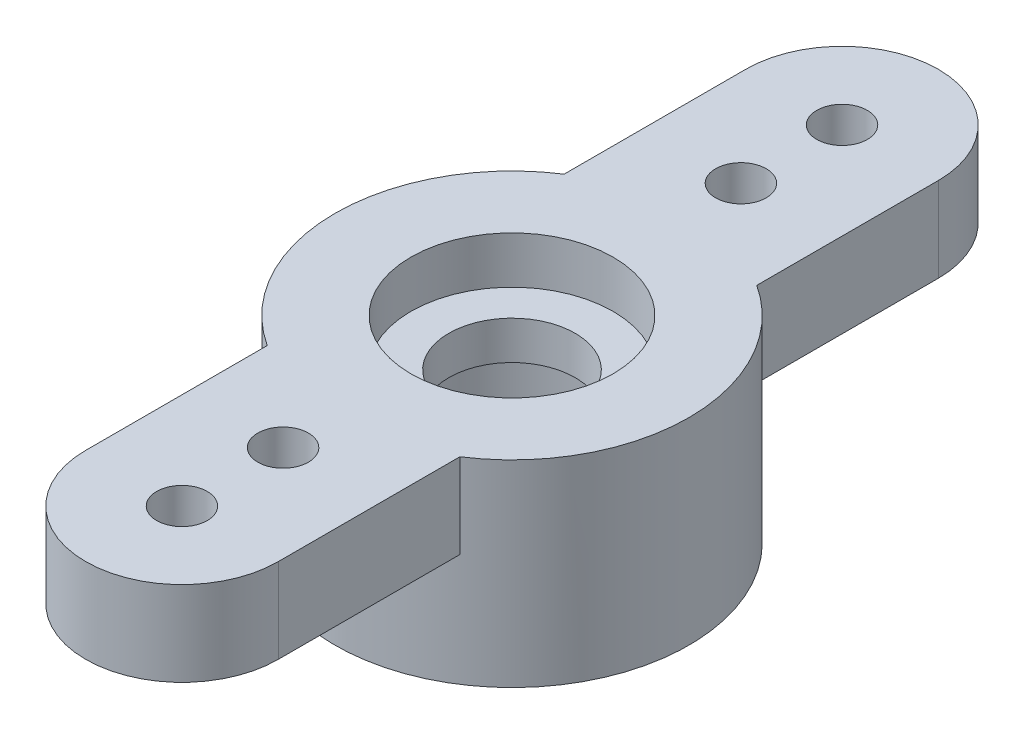
ISO-10303-21;
HEADER;
FILE_DESCRIPTION(('STEP AP214'),'2;1');
FILE_NAME('part.step','',(''),(''),'','','');
FILE_SCHEMA(('AUTOMOTIVE_DESIGN { 1 0 10303 214 1 1 1 1 }'));
ENDSEC;
DATA;
#1=APPLICATION_CONTEXT('core data for automotive mechanical design processes');
#2=APPLICATION_PROTOCOL_DEFINITION('international standard','automotive_design',2000,#1);
#3=PRODUCT_CONTEXT('',#1,'mechanical');
#4=PRODUCT('Part','Part','',(#3));
#5=PRODUCT_RELATED_PRODUCT_CATEGORY('part','',(#4));
#6=PRODUCT_DEFINITION_FORMATION('','',#4);
#7=PRODUCT_DEFINITION_CONTEXT('part definition',#1,'design');
#8=PRODUCT_DEFINITION('design','',#6,#7);
#9=PRODUCT_DEFINITION_SHAPE('','',#8);
#10=(LENGTH_UNIT() NAMED_UNIT(*) SI_UNIT(.MILLI.,.METRE.));
#11=(NAMED_UNIT(*) PLANE_ANGLE_UNIT() SI_UNIT($,.RADIAN.));
#12=(NAMED_UNIT(*) SI_UNIT($,.STERADIAN.) SOLID_ANGLE_UNIT());
#13=UNCERTAINTY_MEASURE_WITH_UNIT(LENGTH_MEASURE(1.E-05),#10,'distance_accuracy_value','');
#14=(GEOMETRIC_REPRESENTATION_CONTEXT(3) GLOBAL_UNCERTAINTY_ASSIGNED_CONTEXT((#13)) GLOBAL_UNIT_ASSIGNED_CONTEXT((#10,
#11,#12)) REPRESENTATION_CONTEXT('',''));
#15=CARTESIAN_POINT('',(0.,0.,0.));
#16=DIRECTION('',(0.,0.,1.));
#17=DIRECTION('',(1.,0.,0.));
#18=AXIS2_PLACEMENT_3D('',#15,#16,#17);
#19=CARTESIAN_POINT('',(0.,0.,0.));
#20=DIRECTION('',(0.,1.,0.));
#21=DIRECTION('',(-1.,0.,0.));
#22=AXIS2_PLACEMENT_3D('',#19,#20,#21);
#23=CYLINDRICAL_SURFACE('',#22,2.25);
#24=CARTESIAN_POINT('',(0.,-2.21,0.));
#25=DIRECTION('',(0.,1.,0.));
#26=DIRECTION('',(-1.,0.,0.));
#27=AXIS2_PLACEMENT_3D('',#24,#25,#26);
#28=CIRCLE('',#27,2.25);
#29=CARTESIAN_POINT('',(-2.25,-2.21,0.));
#30=VERTEX_POINT('',#29);
#31=EDGE_CURVE('E11',#30,#30,#28,.T.);
#32=ORIENTED_EDGE('',*,*,#31,.F.);
#33=EDGE_LOOP('',(#32));
#34=FACE_BOUND('',#33,.T.);
#35=CARTESIAN_POINT('',(0.,0.,0.));
#36=DIRECTION('',(0.,1.,0.));
#37=DIRECTION('',(-1.,0.,0.));
#38=AXIS2_PLACEMENT_3D('',#35,#36,#37);
#39=CIRCLE('',#38,2.25);
#40=CARTESIAN_POINT('',(-2.25,0.,0.));
#41=VERTEX_POINT('',#40);
#42=EDGE_CURVE('E194',#41,#41,#39,.T.);
#43=ORIENTED_EDGE('',*,*,#42,.T.);
#44=EDGE_LOOP('',(#43));
#45=FACE_BOUND('',#44,.T.);
#46=ADVANCED_FACE('F38',(#34,#45),#23,.F.);
#47=CARTESIAN_POINT('',(3.5,-2.21,0.));
#48=DIRECTION('',(0.,1.,0.));
#49=DIRECTION('',(-1.,0.,0.));
#50=AXIS2_PLACEMENT_3D('',#47,#48,#49);
#51=PLANE('',#50);
#52=CARTESIAN_POINT('',(0.,-2.21,0.));
#53=DIRECTION('',(0.,1.,0.));
#54=DIRECTION('',(-1.,0.,0.));
#55=AXIS2_PLACEMENT_3D('',#52,#53,#54);
#56=CIRCLE('',#55,3.5);
#57=CARTESIAN_POINT('',(-3.5,-2.21,0.));
#58=VERTEX_POINT('',#57);
#59=EDGE_CURVE('E46',#58,#58,#56,.T.);
#60=ORIENTED_EDGE('',*,*,#59,.F.);
#61=EDGE_LOOP('',(#60));
#62=FACE_BOUND('',#61,.T.);
#63=ORIENTED_EDGE('',*,*,#31,.T.);
#64=EDGE_LOOP('',(#63));
#65=FACE_BOUND('',#64,.T.);
#66=ADVANCED_FACE('F226',(#62,#65),#51,.F.);
#67=CARTESIAN_POINT('',(0.,0.,0.));
#68=DIRECTION('',(0.,1.,0.));
#69=DIRECTION('',(-1.,0.,0.));
#70=AXIS2_PLACEMENT_3D('',#67,#68,#69);
#71=CYLINDRICAL_SURFACE('',#70,3.5);
#72=CARTESIAN_POINT('',(0.,0.0149999999999994,0.));
#73=DIRECTION('',(0.,-1.,0.));
#74=DIRECTION('',(-1.,0.,0.));
#75=AXIS2_PLACEMENT_3D('',#72,#73,#74);
#76=CIRCLE('',#75,3.5);
#77=CARTESIAN_POINT('',(1.905,0.0149999999999996,2.93614968964459));
#78=VERTEX_POINT('',#77);
#79=CARTESIAN_POINT('',(-1.905,0.0149999999999992,2.93614968964459));
#80=VERTEX_POINT('',#79);
#81=EDGE_CURVE('E126',#78,#80,#76,.T.);
#82=ORIENTED_EDGE('',*,*,#81,.T.);
#83=DIRECTION('',(0.,1.,0.));
#84=VECTOR('',#83,1.);
#85=CARTESIAN_POINT('',(-1.905,0.0149999999999992,2.93614968964459));
#86=LINE('',#85,#84);
#87=CARTESIAN_POINT('',(-1.905,1.69,2.93614968964459));
#88=VERTEX_POINT('',#87);
#89=EDGE_CURVE('E146',#80,#88,#86,.T.);
#90=ORIENTED_EDGE('',*,*,#89,.T.);
#91=CARTESIAN_POINT('',(0.,1.69,0.));
#92=DIRECTION('',(0.,1.,0.));
#93=DIRECTION('',(-1.,0.,0.));
#94=AXIS2_PLACEMENT_3D('',#91,#92,#93);
#95=CIRCLE('',#94,3.5);
#96=CARTESIAN_POINT('',(-1.905,1.69,-2.93614968964459));
#97=VERTEX_POINT('',#96);
#98=EDGE_CURVE('E219',#97,#88,#95,.T.);
#99=ORIENTED_EDGE('',*,*,#98,.F.);
#100=DIRECTION('',(0.,1.,0.));
#101=VECTOR('',#100,1.);
#102=CARTESIAN_POINT('',(-1.905,0.0149999999999992,-2.93614968964459));
#103=LINE('',#102,#101);
#104=CARTESIAN_POINT('',(-1.905,0.0149999999999992,-2.93614968964459));
#105=VERTEX_POINT('',#104);
#106=EDGE_CURVE('E198',#105,#97,#103,.T.);
#107=ORIENTED_EDGE('',*,*,#106,.F.);
#108=CARTESIAN_POINT('',(0.,0.0149999999999994,0.));
#109=DIRECTION('',(0.,-1.,0.));
#110=DIRECTION('',(1.,0.,0.));
#111=AXIS2_PLACEMENT_3D('',#108,#109,#110);
#112=CIRCLE('',#111,3.5);
#113=CARTESIAN_POINT('',(1.905,0.0149999999999996,-2.93614968964459));
#114=VERTEX_POINT('',#113);
#115=EDGE_CURVE('E175',#105,#114,#112,.T.);
#116=ORIENTED_EDGE('',*,*,#115,.T.);
#117=DIRECTION('',(0.,1.,0.));
#118=VECTOR('',#117,1.);
#119=CARTESIAN_POINT('',(1.905,0.0149999999999996,-2.93614968964459));
#120=LINE('',#119,#118);
#121=CARTESIAN_POINT('',(1.905,1.69,-2.93614968964459));
#122=VERTEX_POINT('',#121);
#123=EDGE_CURVE('E195',#114,#122,#120,.T.);
#124=ORIENTED_EDGE('',*,*,#123,.T.);
#125=CARTESIAN_POINT('',(1.905,1.69,2.93614968964459));
#126=VERTEX_POINT('',#125);
#127=EDGE_CURVE('E218',#126,#122,#95,.T.);
#128=ORIENTED_EDGE('',*,*,#127,.F.);
#129=DIRECTION('',(0.,1.,0.));
#130=VECTOR('',#129,1.);
#131=CARTESIAN_POINT('',(1.905,0.0149999999999996,2.93614968964459));
#132=LINE('',#131,#130);
#133=EDGE_CURVE('E116',#78,#126,#132,.T.);
#134=ORIENTED_EDGE('',*,*,#133,.F.);
#135=EDGE_LOOP('',(#82,#90,#99,#107,#116,#124,#128,#134));
#136=FACE_BOUND('',#135,.T.);
#137=ORIENTED_EDGE('',*,*,#59,.T.);
#138=EDGE_LOOP('',(#137));
#139=FACE_BOUND('',#138,.T.);
#140=ADVANCED_FACE('F224',(#136,#139),#71,.T.);
#141=CARTESIAN_POINT('',(2.,1.69,0.));
#142=DIRECTION('',(0.,-1.,0.));
#143=DIRECTION('',(1.,0.,0.));
#144=AXIS2_PLACEMENT_3D('',#141,#142,#143);
#145=PLANE('',#144);
#146=CARTESIAN_POINT('',(0.,1.69,0.));
#147=DIRECTION('',(0.,1.,0.));
#148=DIRECTION('',(-1.,0.,0.));
#149=AXIS2_PLACEMENT_3D('',#146,#147,#148);
#150=CIRCLE('',#149,2.);
#151=CARTESIAN_POINT('',(-2.,1.69,0.));
#152=VERTEX_POINT('',#151);
#153=EDGE_CURVE('E215',#152,#152,#150,.T.);
#154=ORIENTED_EDGE('',*,*,#153,.F.);
#155=EDGE_LOOP('',(#154));
#156=FACE_BOUND('',#155,.T.);
#157=ORIENTED_EDGE('',*,*,#98,.T.);
#158=DIRECTION('',(0.,0.,1.));
#159=VECTOR('',#158,1.);
#160=CARTESIAN_POINT('',(-1.905,1.69,6.5278));
#161=LINE('',#160,#159);
#162=CARTESIAN_POINT('',(-1.905,1.69,6.5278));
#163=VERTEX_POINT('',#162);
#164=EDGE_CURVE('E130',#88,#163,#161,.T.);
#165=ORIENTED_EDGE('',*,*,#164,.T.);
#166=CARTESIAN_POINT('',(0.,1.69,6.5278));
#167=DIRECTION('',(0.,1.,0.));
#168=DIRECTION('',(-1.,0.,0.));
#169=AXIS2_PLACEMENT_3D('',#166,#167,#168);
#170=CIRCLE('',#169,1.905);
#171=CARTESIAN_POINT('',(1.905,1.69,6.5278));
#172=VERTEX_POINT('',#171);
#173=EDGE_CURVE('E140',#163,#172,#170,.T.);
#174=ORIENTED_EDGE('',*,*,#173,.T.);
#175=DIRECTION('',(0.,0.,-1.));
#176=VECTOR('',#175,1.);
#177=CARTESIAN_POINT('',(1.905,1.69,6.5278));
#178=LINE('',#177,#176);
#179=EDGE_CURVE('E53',#172,#126,#178,.T.);
#180=ORIENTED_EDGE('',*,*,#179,.T.);
#181=ORIENTED_EDGE('',*,*,#127,.T.);
#182=DIRECTION('',(0.,0.,-1.));
#183=VECTOR('',#182,1.);
#184=CARTESIAN_POINT('',(1.905,1.69,-6.5278));
#185=LINE('',#184,#183);
#186=CARTESIAN_POINT('',(1.905,1.69,-6.5278));
#187=VERTEX_POINT('',#186);
#188=EDGE_CURVE('E171',#122,#187,#185,.T.);
#189=ORIENTED_EDGE('',*,*,#188,.T.);
#190=CARTESIAN_POINT('',(0.,1.69,-6.5278));
#191=DIRECTION('',(0.,1.,0.));
#192=DIRECTION('',(1.,0.,0.));
#193=AXIS2_PLACEMENT_3D('',#190,#191,#192);
#194=CIRCLE('',#193,1.905);
#195=CARTESIAN_POINT('',(-1.905,1.69,-6.5278));
#196=VERTEX_POINT('',#195);
#197=EDGE_CURVE('E162',#187,#196,#194,.T.);
#198=ORIENTED_EDGE('',*,*,#197,.T.);
#199=DIRECTION('',(0.,0.,1.));
#200=VECTOR('',#199,1.);
#201=CARTESIAN_POINT('',(-1.905,1.69,-6.5278));
#202=LINE('',#201,#200);
#203=EDGE_CURVE('E60',#196,#97,#202,.T.);
#204=ORIENTED_EDGE('',*,*,#203,.T.);
#205=EDGE_LOOP('',(#157,#165,#174,#180,#181,#189,#198,#204));
#206=FACE_BOUND('',#205,.T.);
#207=CARTESIAN_POINT('',(0.,1.69,-4.5278));
#208=DIRECTION('',(0.,1.,0.));
#209=DIRECTION('',(-1.,0.,0.));
#210=AXIS2_PLACEMENT_3D('',#207,#208,#209);
#211=CIRCLE('',#210,0.5);
#212=CARTESIAN_POINT('',(-0.5,1.69,-4.5278));
#213=VERTEX_POINT('',#212);
#214=EDGE_CURVE('E145',#213,#213,#211,.T.);
#215=ORIENTED_EDGE('',*,*,#214,.F.);
#216=EDGE_LOOP('',(#215));
#217=FACE_BOUND('',#216,.T.);
#218=CARTESIAN_POINT('',(0.,1.69,-6.5278));
#219=DIRECTION('',(0.,1.,0.));
#220=DIRECTION('',(-1.,0.,0.));
#221=AXIS2_PLACEMENT_3D('',#218,#219,#220);
#222=CIRCLE('',#221,0.5);
#223=CARTESIAN_POINT('',(-0.500000000000001,1.69,-6.5278));
#224=VERTEX_POINT('',#223);
#225=EDGE_CURVE('E154',#224,#224,#222,.T.);
#226=ORIENTED_EDGE('',*,*,#225,.F.);
#227=EDGE_LOOP('',(#226));
#228=FACE_BOUND('',#227,.T.);
#229=CARTESIAN_POINT('',(0.,1.69,4.5278));
#230=DIRECTION('',(0.,1.,0.));
#231=DIRECTION('',(1.,0.,0.));
#232=AXIS2_PLACEMENT_3D('',#229,#230,#231);
#233=CIRCLE('',#232,0.5);
#234=CARTESIAN_POINT('',(0.5,1.69,4.5278));
#235=VERTEX_POINT('',#234);
#236=EDGE_CURVE('E272',#235,#235,#233,.T.);
#237=ORIENTED_EDGE('',*,*,#236,.F.);
#238=EDGE_LOOP('',(#237));
#239=FACE_BOUND('',#238,.T.);
#240=CARTESIAN_POINT('',(0.,1.69,6.5278));
#241=DIRECTION('',(0.,1.,0.));
#242=DIRECTION('',(1.,0.,0.));
#243=AXIS2_PLACEMENT_3D('',#240,#241,#242);
#244=CIRCLE('',#243,0.5);
#245=CARTESIAN_POINT('',(0.500000000000001,1.69,6.5278));
#246=VERTEX_POINT('',#245);
#247=EDGE_CURVE('E135',#246,#246,#244,.T.);
#248=ORIENTED_EDGE('',*,*,#247,.F.);
#249=EDGE_LOOP('',(#248));
#250=FACE_BOUND('',#249,.T.);
#251=ADVANCED_FACE('F257',(#156,#206,#217,#228,#239,#250),#145,.F.);
#252=CARTESIAN_POINT('',(0.,0.,0.));
#253=DIRECTION('',(0.,1.,0.));
#254=DIRECTION('',(-1.,0.,0.));
#255=AXIS2_PLACEMENT_3D('',#252,#253,#254);
#256=CYLINDRICAL_SURFACE('',#255,2.);
#257=CARTESIAN_POINT('',(0.,0.759999999999999,0.));
#258=DIRECTION('',(0.,1.,0.));
#259=DIRECTION('',(-1.,0.,0.));
#260=AXIS2_PLACEMENT_3D('',#257,#258,#259);
#261=CIRCLE('',#260,2.);
#262=CARTESIAN_POINT('',(-2.,0.759999999999999,0.));
#263=VERTEX_POINT('',#262);
#264=EDGE_CURVE('E212',#263,#263,#261,.T.);
#265=ORIENTED_EDGE('',*,*,#264,.F.);
#266=EDGE_LOOP('',(#265));
#267=FACE_BOUND('',#266,.T.);
#268=ORIENTED_EDGE('',*,*,#153,.T.);
#269=EDGE_LOOP('',(#268));
#270=FACE_BOUND('',#269,.T.);
#271=ADVANCED_FACE('F251',(#267,#270),#256,.F.);
#272=CARTESIAN_POINT('',(1.25,0.76,0.));
#273=DIRECTION('',(0.,-1.,0.));
#274=DIRECTION('',(1.,0.,0.));
#275=AXIS2_PLACEMENT_3D('',#272,#273,#274);
#276=PLANE('',#275);
#277=CARTESIAN_POINT('',(0.,0.759999999999999,0.));
#278=DIRECTION('',(0.,1.,0.));
#279=DIRECTION('',(-1.,0.,0.));
#280=AXIS2_PLACEMENT_3D('',#277,#278,#279);
#281=CIRCLE('',#280,1.25);
#282=CARTESIAN_POINT('',(-1.25,0.759999999999999,0.));
#283=VERTEX_POINT('',#282);
#284=EDGE_CURVE('E208',#283,#283,#281,.T.);
#285=ORIENTED_EDGE('',*,*,#284,.F.);
#286=EDGE_LOOP('',(#285));
#287=FACE_BOUND('',#286,.T.);
#288=ORIENTED_EDGE('',*,*,#264,.T.);
#289=EDGE_LOOP('',(#288));
#290=FACE_BOUND('',#289,.T.);
#291=ADVANCED_FACE('F245',(#287,#290),#276,.F.);
#292=CARTESIAN_POINT('',(0.,0.,0.));
#293=DIRECTION('',(0.,1.,0.));
#294=DIRECTION('',(-1.,0.,0.));
#295=AXIS2_PLACEMENT_3D('',#292,#293,#294);
#296=CYLINDRICAL_SURFACE('',#295,1.25);
#297=CARTESIAN_POINT('',(0.,0.,0.));
#298=DIRECTION('',(0.,1.,0.));
#299=DIRECTION('',(-1.,0.,0.));
#300=AXIS2_PLACEMENT_3D('',#297,#298,#299);
#301=CIRCLE('',#300,1.25);
#302=CARTESIAN_POINT('',(-1.25,0.,0.));
#303=VERTEX_POINT('',#302);
#304=EDGE_CURVE('E204',#303,#303,#301,.T.);
#305=ORIENTED_EDGE('',*,*,#304,.F.);
#306=EDGE_LOOP('',(#305));
#307=FACE_BOUND('',#306,.T.);
#308=ORIENTED_EDGE('',*,*,#284,.T.);
#309=EDGE_LOOP('',(#308));
#310=FACE_BOUND('',#309,.T.);
#311=ADVANCED_FACE('F239',(#307,#310),#296,.F.);
#312=CARTESIAN_POINT('',(2.25,0.,0.));
#313=DIRECTION('',(0.,1.,0.));
#314=DIRECTION('',(-1.,0.,0.));
#315=AXIS2_PLACEMENT_3D('',#312,#313,#314);
#316=PLANE('',#315);
#317=ORIENTED_EDGE('',*,*,#42,.F.);
#318=EDGE_LOOP('',(#317));
#319=FACE_BOUND('',#318,.T.);
#320=ORIENTED_EDGE('',*,*,#304,.T.);
#321=EDGE_LOOP('',(#320));
#322=FACE_BOUND('',#321,.T.);
#323=ADVANCED_FACE('F235',(#319,#322),#316,.F.);
#324=CARTESIAN_POINT('',(0.,0.0149999999999994,-6.5278));
#325=DIRECTION('',(0.,1.,0.));
#326=DIRECTION('',(-1.,0.,0.));
#327=AXIS2_PLACEMENT_3D('',#324,#325,#326);
#328=CYLINDRICAL_SURFACE('',#327,1.905);
#329=ORIENTED_EDGE('',*,*,#197,.F.);
#330=DIRECTION('',(0.,1.,0.));
#331=VECTOR('',#330,1.);
#332=CARTESIAN_POINT('',(1.905,0.0149999999999996,-6.5278));
#333=LINE('',#332,#331);
#334=CARTESIAN_POINT('',(1.905,0.0149999999999996,-6.5278));
#335=VERTEX_POINT('',#334);
#336=EDGE_CURVE('E191',#335,#187,#333,.T.);
#337=ORIENTED_EDGE('',*,*,#336,.F.);
#338=CARTESIAN_POINT('',(0.,0.0149999999999994,-6.5278));
#339=DIRECTION('',(0.,1.,0.));
#340=DIRECTION('',(1.,0.,0.));
#341=AXIS2_PLACEMENT_3D('',#338,#339,#340);
#342=CIRCLE('',#341,1.905);
#343=CARTESIAN_POINT('',(-1.905,0.0149999999999992,-6.5278));
#344=VERTEX_POINT('',#343);
#345=EDGE_CURVE('E166',#335,#344,#342,.T.);
#346=ORIENTED_EDGE('',*,*,#345,.T.);
#347=DIRECTION('',(0.,1.,0.));
#348=VECTOR('',#347,1.);
#349=CARTESIAN_POINT('',(-1.905,0.0149999999999992,-6.5278));
#350=LINE('',#349,#348);
#351=EDGE_CURVE('E183',#344,#196,#350,.T.);
#352=ORIENTED_EDGE('',*,*,#351,.T.);
#353=EDGE_LOOP('',(#329,#337,#346,#352));
#354=FACE_BOUND('',#353,.T.);
#355=ADVANCED_FACE('F238',(#354),#328,.T.);
#356=CARTESIAN_POINT('',(1.905,0.0149999999999996,-6.5278));
#357=DIRECTION('',(1.,0.,0.));
#358=DIRECTION('',(0.,0.,-1.));
#359=AXIS2_PLACEMENT_3D('',#356,#357,#358);
#360=PLANE('',#359);
#361=ORIENTED_EDGE('',*,*,#188,.F.);
#362=ORIENTED_EDGE('',*,*,#123,.F.);
#363=DIRECTION('',(0.,0.,-1.));
#364=VECTOR('',#363,1.);
#365=CARTESIAN_POINT('',(1.905,0.0149999999999996,-6.5278));
#366=LINE('',#365,#364);
#367=EDGE_CURVE('E179',#114,#335,#366,.T.);
#368=ORIENTED_EDGE('',*,*,#367,.T.);
#369=ORIENTED_EDGE('',*,*,#336,.T.);
#370=EDGE_LOOP('',(#361,#362,#368,#369));
#371=FACE_BOUND('',#370,.T.);
#372=ADVANCED_FACE('F318',(#371),#360,.T.);
#373=CARTESIAN_POINT('',(-1.905,0.0149999999999992,-6.5278));
#374=DIRECTION('',(-1.,0.,0.));
#375=DIRECTION('',(0.,-1.,0.));
#376=AXIS2_PLACEMENT_3D('',#373,#374,#375);
#377=PLANE('',#376);
#378=ORIENTED_EDGE('',*,*,#203,.F.);
#379=ORIENTED_EDGE('',*,*,#351,.F.);
#380=DIRECTION('',(0.,0.,1.));
#381=VECTOR('',#380,1.);
#382=CARTESIAN_POINT('',(-1.905,0.0149999999999992,-6.5278));
#383=LINE('',#382,#381);
#384=EDGE_CURVE('E170',#344,#105,#383,.T.);
#385=ORIENTED_EDGE('',*,*,#384,.T.);
#386=ORIENTED_EDGE('',*,*,#106,.T.);
#387=EDGE_LOOP('',(#378,#379,#385,#386));
#388=FACE_BOUND('',#387,.T.);
#389=ADVANCED_FACE('F316',(#388),#377,.T.);
#390=CARTESIAN_POINT('',(0.,0.0149999999999994,-6.5278));
#391=DIRECTION('',(0.,-1.,0.));
#392=DIRECTION('',(1.,0.,0.));
#393=AXIS2_PLACEMENT_3D('',#390,#391,#392);
#394=PLANE('',#393);
#395=CARTESIAN_POINT('',(0.,0.0149999999999994,-4.5278));
#396=DIRECTION('',(0.,1.,0.));
#397=DIRECTION('',(-1.,0.,0.));
#398=AXIS2_PLACEMENT_3D('',#395,#396,#397);
#399=CIRCLE('',#398,0.5);
#400=CARTESIAN_POINT('',(-0.5,0.0149999999999993,-4.5278));
#401=VERTEX_POINT('',#400);
#402=EDGE_CURVE('E150',#401,#401,#399,.T.);
#403=ORIENTED_EDGE('',*,*,#402,.T.);
#404=EDGE_LOOP('',(#403));
#405=FACE_BOUND('',#404,.T.);
#406=CARTESIAN_POINT('',(0.,0.0149999999999994,-6.5278));
#407=DIRECTION('',(0.,1.,0.));
#408=DIRECTION('',(-1.,0.,0.));
#409=AXIS2_PLACEMENT_3D('',#406,#407,#408);
#410=CIRCLE('',#409,0.5);
#411=CARTESIAN_POINT('',(-0.500000000000001,0.0149999999999993,-6.5278));
#412=VERTEX_POINT('',#411);
#413=EDGE_CURVE('E158',#412,#412,#410,.T.);
#414=ORIENTED_EDGE('',*,*,#413,.T.);
#415=EDGE_LOOP('',(#414));
#416=FACE_BOUND('',#415,.T.);
#417=ORIENTED_EDGE('',*,*,#345,.F.);
#418=ORIENTED_EDGE('',*,*,#367,.F.);
#419=ORIENTED_EDGE('',*,*,#115,.F.);
#420=ORIENTED_EDGE('',*,*,#384,.F.);
#421=EDGE_LOOP('',(#417,#418,#419,#420));
#422=FACE_BOUND('',#421,.T.);
#423=ADVANCED_FACE('F312',(#405,#416,#422),#394,.T.);
#424=CARTESIAN_POINT('',(0.,0.0149999999999994,-6.5278));
#425=DIRECTION('',(0.,1.,0.));
#426=DIRECTION('',(-1.,0.,0.));
#427=AXIS2_PLACEMENT_3D('',#424,#425,#426);
#428=CYLINDRICAL_SURFACE('',#427,0.5);
#429=ORIENTED_EDGE('',*,*,#413,.F.);
#430=EDGE_LOOP('',(#429));
#431=FACE_BOUND('',#430,.T.);
#432=ORIENTED_EDGE('',*,*,#225,.T.);
#433=EDGE_LOOP('',(#432));
#434=FACE_BOUND('',#433,.T.);
#435=ADVANCED_FACE('F308',(#431,#434),#428,.F.);
#436=CARTESIAN_POINT('',(0.,0.0149999999999994,-4.5278));
#437=DIRECTION('',(0.,1.,0.));
#438=DIRECTION('',(-1.,0.,0.));
#439=AXIS2_PLACEMENT_3D('',#436,#437,#438);
#440=CYLINDRICAL_SURFACE('',#439,0.5);
#441=ORIENTED_EDGE('',*,*,#402,.F.);
#442=EDGE_LOOP('',(#441));
#443=FACE_BOUND('',#442,.T.);
#444=ORIENTED_EDGE('',*,*,#214,.T.);
#445=EDGE_LOOP('',(#444));
#446=FACE_BOUND('',#445,.T.);
#447=ADVANCED_FACE('F305',(#443,#446),#440,.F.);
#448=CARTESIAN_POINT('',(0.,0.0149999999999994,6.5278));
#449=DIRECTION('',(0.,1.,0.));
#450=DIRECTION('',(-1.,0.,0.));
#451=AXIS2_PLACEMENT_3D('',#448,#449,#450);
#452=CYLINDRICAL_SURFACE('',#451,1.905);
#453=ORIENTED_EDGE('',*,*,#173,.F.);
#454=DIRECTION('',(0.,1.,0.));
#455=VECTOR('',#454,1.);
#456=CARTESIAN_POINT('',(-1.905,0.0149999999999992,6.5278));
#457=LINE('',#456,#455);
#458=CARTESIAN_POINT('',(-1.905,0.0149999999999992,6.5278));
#459=VERTEX_POINT('',#458);
#460=EDGE_CURVE('E129',#459,#163,#457,.T.);
#461=ORIENTED_EDGE('',*,*,#460,.F.);
#462=CARTESIAN_POINT('',(0.,0.0149999999999994,6.5278));
#463=DIRECTION('',(0.,1.,0.));
#464=DIRECTION('',(-1.,0.,0.));
#465=AXIS2_PLACEMENT_3D('',#462,#463,#464);
#466=CIRCLE('',#465,1.905);
#467=CARTESIAN_POINT('',(1.905,0.0149999999999996,6.5278));
#468=VERTEX_POINT('',#467);
#469=EDGE_CURVE('E123',#459,#468,#466,.T.);
#470=ORIENTED_EDGE('',*,*,#469,.T.);
#471=DIRECTION('',(0.,1.,0.));
#472=VECTOR('',#471,1.);
#473=CARTESIAN_POINT('',(1.905,0.0149999999999996,6.5278));
#474=LINE('',#473,#472);
#475=EDGE_CURVE('E108',#468,#172,#474,.T.);
#476=ORIENTED_EDGE('',*,*,#475,.T.);
#477=EDGE_LOOP('',(#453,#461,#470,#476));
#478=FACE_BOUND('',#477,.T.);
#479=ADVANCED_FACE('F128',(#478),#452,.T.);
#480=CARTESIAN_POINT('',(-1.905,0.0149999999999992,6.5278));
#481=DIRECTION('',(-1.,0.,0.));
#482=DIRECTION('',(0.,0.,1.));
#483=AXIS2_PLACEMENT_3D('',#480,#481,#482);
#484=PLANE('',#483);
#485=ORIENTED_EDGE('',*,*,#164,.F.);
#486=ORIENTED_EDGE('',*,*,#89,.F.);
#487=DIRECTION('',(0.,0.,1.));
#488=VECTOR('',#487,1.);
#489=CARTESIAN_POINT('',(-1.905,0.0149999999999992,6.5278));
#490=LINE('',#489,#488);
#491=EDGE_CURVE('E117',#80,#459,#490,.T.);
#492=ORIENTED_EDGE('',*,*,#491,.T.);
#493=ORIENTED_EDGE('',*,*,#460,.T.);
#494=EDGE_LOOP('',(#485,#486,#492,#493));
#495=FACE_BOUND('',#494,.T.);
#496=ADVANCED_FACE('F297',(#495),#484,.T.);
#497=CARTESIAN_POINT('',(1.905,0.0149999999999996,6.5278));
#498=DIRECTION('',(1.,0.,0.));
#499=DIRECTION('',(0.,1.,0.));
#500=AXIS2_PLACEMENT_3D('',#497,#498,#499);
#501=PLANE('',#500);
#502=ORIENTED_EDGE('',*,*,#179,.F.);
#503=ORIENTED_EDGE('',*,*,#475,.F.);
#504=DIRECTION('',(0.,0.,-1.));
#505=VECTOR('',#504,1.);
#506=CARTESIAN_POINT('',(1.905,0.0149999999999996,6.5278));
#507=LINE('',#506,#505);
#508=EDGE_CURVE('E111',#468,#78,#507,.T.);
#509=ORIENTED_EDGE('',*,*,#508,.T.);
#510=ORIENTED_EDGE('',*,*,#133,.T.);
#511=EDGE_LOOP('',(#502,#503,#509,#510));
#512=FACE_BOUND('',#511,.T.);
#513=ADVANCED_FACE('F110',(#512),#501,.T.);
#514=CARTESIAN_POINT('',(0.,0.0149999999999994,6.5278));
#515=DIRECTION('',(0.,-1.,0.));
#516=DIRECTION('',(-1.,0.,0.));
#517=AXIS2_PLACEMENT_3D('',#514,#515,#516);
#518=PLANE('',#517);
#519=CARTESIAN_POINT('',(0.,0.0149999999999994,4.5278));
#520=DIRECTION('',(0.,1.,0.));
#521=DIRECTION('',(1.,0.,0.));
#522=AXIS2_PLACEMENT_3D('',#519,#520,#521);
#523=CIRCLE('',#522,0.5);
#524=CARTESIAN_POINT('',(0.5,0.0149999999999994,4.5278));
#525=VERTEX_POINT('',#524);
#526=EDGE_CURVE('E276',#525,#525,#523,.T.);
#527=ORIENTED_EDGE('',*,*,#526,.T.);
#528=EDGE_LOOP('',(#527));
#529=FACE_BOUND('',#528,.T.);
#530=CARTESIAN_POINT('',(0.,0.0149999999999994,6.5278));
#531=DIRECTION('',(0.,1.,0.));
#532=DIRECTION('',(1.,0.,0.));
#533=AXIS2_PLACEMENT_3D('',#530,#531,#532);
#534=CIRCLE('',#533,0.5);
#535=CARTESIAN_POINT('',(0.500000000000001,0.0149999999999994,6.5278));
#536=VERTEX_POINT('',#535);
#537=EDGE_CURVE('E142',#536,#536,#534,.T.);
#538=ORIENTED_EDGE('',*,*,#537,.T.);
#539=EDGE_LOOP('',(#538));
#540=FACE_BOUND('',#539,.T.);
#541=ORIENTED_EDGE('',*,*,#469,.F.);
#542=ORIENTED_EDGE('',*,*,#491,.F.);
#543=ORIENTED_EDGE('',*,*,#81,.F.);
#544=ORIENTED_EDGE('',*,*,#508,.F.);
#545=EDGE_LOOP('',(#541,#542,#543,#544));
#546=FACE_BOUND('',#545,.T.);
#547=ADVANCED_FACE('F121',(#529,#540,#546),#518,.T.);
#548=CARTESIAN_POINT('',(0.,0.0149999999999994,6.5278));
#549=DIRECTION('',(0.,1.,0.));
#550=DIRECTION('',(-1.,0.,0.));
#551=AXIS2_PLACEMENT_3D('',#548,#549,#550);
#552=CYLINDRICAL_SURFACE('',#551,0.5);
#553=ORIENTED_EDGE('',*,*,#537,.F.);
#554=EDGE_LOOP('',(#553));
#555=FACE_BOUND('',#554,.T.);
#556=ORIENTED_EDGE('',*,*,#247,.T.);
#557=EDGE_LOOP('',(#556));
#558=FACE_BOUND('',#557,.T.);
#559=ADVANCED_FACE('F286',(#555,#558),#552,.F.);
#560=CARTESIAN_POINT('',(0.,0.0149999999999994,4.5278));
#561=DIRECTION('',(0.,1.,0.));
#562=DIRECTION('',(-1.,0.,0.));
#563=AXIS2_PLACEMENT_3D('',#560,#561,#562);
#564=CYLINDRICAL_SURFACE('',#563,0.5);
#565=ORIENTED_EDGE('',*,*,#526,.F.);
#566=EDGE_LOOP('',(#565));
#567=FACE_BOUND('',#566,.T.);
#568=ORIENTED_EDGE('',*,*,#236,.T.);
#569=EDGE_LOOP('',(#568));
#570=FACE_BOUND('',#569,.T.);
#571=ADVANCED_FACE('F284',(#567,#570),#564,.F.);
#572=CLOSED_SHELL('',(#46,#66,#140,#251,#271,#291,#311,#323,#355,#372,#389,#423,#435,#447,#479,
#496,#513,#547,#559,#571));
#573=MANIFOLD_SOLID_BREP('B2',#572);
#574=ADVANCED_BREP_SHAPE_REPRESENTATION('',(#18,#573),#14);
#575=SHAPE_DEFINITION_REPRESENTATION(#9,#574);
ENDSEC;
END-ISO-10303-21;
